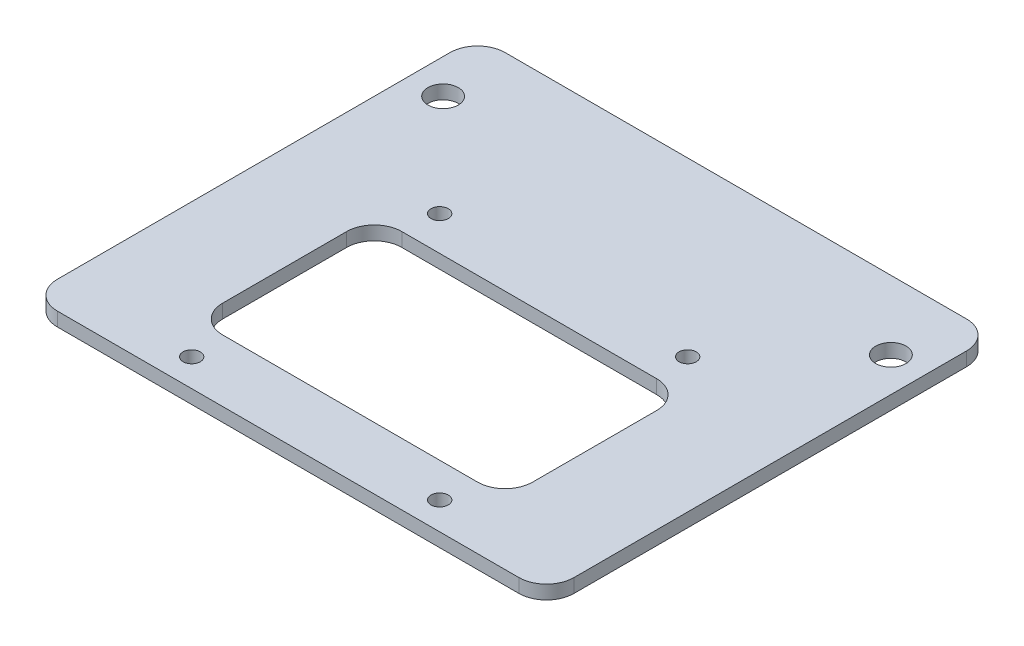
ISO-10303-21;
HEADER;
FILE_DESCRIPTION(('STEP AP214'),'2;1');
FILE_NAME('part.step','',(''),(''),'','','');
FILE_SCHEMA(('AUTOMOTIVE_DESIGN { 1 0 10303 214 1 1 1 1 }'));
ENDSEC;
DATA;
#1=APPLICATION_CONTEXT('core data for automotive mechanical design processes');
#2=APPLICATION_PROTOCOL_DEFINITION('international standard','automotive_design',2000,#1);
#3=PRODUCT_CONTEXT('',#1,'mechanical');
#4=PRODUCT('Part','Part','',(#3));
#5=PRODUCT_RELATED_PRODUCT_CATEGORY('part','',(#4));
#6=PRODUCT_DEFINITION_FORMATION('','',#4);
#7=PRODUCT_DEFINITION_CONTEXT('part definition',#1,'design');
#8=PRODUCT_DEFINITION('design','',#6,#7);
#9=PRODUCT_DEFINITION_SHAPE('','',#8);
#10=(LENGTH_UNIT() NAMED_UNIT(*) SI_UNIT(.MILLI.,.METRE.));
#11=(NAMED_UNIT(*) PLANE_ANGLE_UNIT() SI_UNIT($,.RADIAN.));
#12=(NAMED_UNIT(*) SI_UNIT($,.STERADIAN.) SOLID_ANGLE_UNIT());
#13=UNCERTAINTY_MEASURE_WITH_UNIT(LENGTH_MEASURE(1.E-05),#10,'distance_accuracy_value','');
#14=(GEOMETRIC_REPRESENTATION_CONTEXT(3) GLOBAL_UNCERTAINTY_ASSIGNED_CONTEXT((#13)) GLOBAL_UNIT_ASSIGNED_CONTEXT((#10,
#11,#12)) REPRESENTATION_CONTEXT('',''));
#15=CARTESIAN_POINT('',(0.,0.,0.));
#16=DIRECTION('',(0.,0.,1.));
#17=DIRECTION('',(1.,0.,0.));
#18=AXIS2_PLACEMENT_3D('',#15,#16,#17);
#19=CARTESIAN_POINT('',(37.5,2.,-32.5));
#20=DIRECTION('',(-1.,0.,0.));
#21=DIRECTION('',(0.,0.,1.));
#22=AXIS2_PLACEMENT_3D('',#19,#20,#21);
#23=PLANE('',#22);
#24=DIRECTION('',(0.,0.,-1.));
#25=VECTOR('',#24,1.);
#26=CARTESIAN_POINT('',(37.5,0.,-32.5));
#27=LINE('',#26,#25);
#28=CARTESIAN_POINT('',(37.5,0.,28.5));
#29=VERTEX_POINT('',#28);
#30=CARTESIAN_POINT('',(37.5,0.,-28.5));
#31=VERTEX_POINT('',#30);
#32=EDGE_CURVE('E175',#29,#31,#27,.T.);
#33=ORIENTED_EDGE('',*,*,#32,.T.);
#34=DIRECTION('',(0.,-1.,0.));
#35=VECTOR('',#34,1.);
#36=CARTESIAN_POINT('',(37.5,2.,-28.5));
#37=LINE('',#36,#35);
#38=CARTESIAN_POINT('',(37.5,2.,-28.5));
#39=VERTEX_POINT('',#38);
#40=EDGE_CURVE('E153',#31,#39,#37,.F.);
#41=ORIENTED_EDGE('',*,*,#40,.T.);
#42=DIRECTION('',(0.,0.,-1.));
#43=VECTOR('',#42,1.);
#44=CARTESIAN_POINT('',(37.5,2.,-32.5));
#45=LINE('',#44,#43);
#46=CARTESIAN_POINT('',(37.5,2.,28.5));
#47=VERTEX_POINT('',#46);
#48=EDGE_CURVE('E186',#47,#39,#45,.T.);
#49=ORIENTED_EDGE('',*,*,#48,.F.);
#50=DIRECTION('',(0.,-1.,0.));
#51=VECTOR('',#50,1.);
#52=CARTESIAN_POINT('',(37.5,2.,28.5));
#53=LINE('',#52,#51);
#54=EDGE_CURVE('E158',#47,#29,#53,.T.);
#55=ORIENTED_EDGE('',*,*,#54,.T.);
#56=EDGE_LOOP('',(#33,#41,#49,#55));
#57=FACE_BOUND('',#56,.T.);
#58=ADVANCED_FACE('F35',(#57),#23,.F.);
#59=CARTESIAN_POINT('',(-37.5,2.,-32.5));
#60=DIRECTION('',(0.,0.,1.));
#61=DIRECTION('',(1.,0.,0.));
#62=AXIS2_PLACEMENT_3D('',#59,#60,#61);
#63=PLANE('',#62);
#64=DIRECTION('',(-1.,0.,0.));
#65=VECTOR('',#64,1.);
#66=CARTESIAN_POINT('',(-37.5,2.,-32.5));
#67=LINE('',#66,#65);
#68=CARTESIAN_POINT('',(33.5,2.,-32.5));
#69=VERTEX_POINT('',#68);
#70=CARTESIAN_POINT('',(-33.5,2.,-32.5));
#71=VERTEX_POINT('',#70);
#72=EDGE_CURVE('E168',#69,#71,#67,.T.);
#73=ORIENTED_EDGE('',*,*,#72,.F.);
#74=DIRECTION('',(0.,-1.,0.));
#75=VECTOR('',#74,1.);
#76=CARTESIAN_POINT('',(33.5,2.,-32.5));
#77=LINE('',#76,#75);
#78=CARTESIAN_POINT('',(33.5,0.,-32.5));
#79=VERTEX_POINT('',#78);
#80=EDGE_CURVE('E152',#69,#79,#77,.T.);
#81=ORIENTED_EDGE('',*,*,#80,.T.);
#82=DIRECTION('',(-1.,0.,0.));
#83=VECTOR('',#82,1.);
#84=CARTESIAN_POINT('',(-37.5,0.,-32.5));
#85=LINE('',#84,#83);
#86=CARTESIAN_POINT('',(-33.5,0.,-32.5));
#87=VERTEX_POINT('',#86);
#88=EDGE_CURVE('E165',#79,#87,#85,.T.);
#89=ORIENTED_EDGE('',*,*,#88,.T.);
#90=DIRECTION('',(0.,-1.,0.));
#91=VECTOR('',#90,1.);
#92=CARTESIAN_POINT('',(-33.5,2.,-32.5));
#93=LINE('',#92,#91);
#94=EDGE_CURVE('E170',#87,#71,#93,.F.);
#95=ORIENTED_EDGE('',*,*,#94,.T.);
#96=EDGE_LOOP('',(#73,#81,#89,#95));
#97=FACE_BOUND('',#96,.T.);
#98=ADVANCED_FACE('F164',(#97),#63,.F.);
#99=CARTESIAN_POINT('',(-37.5,2.,-32.5));
#100=DIRECTION('',(1.,0.,0.));
#101=DIRECTION('',(0.,0.,-1.));
#102=AXIS2_PLACEMENT_3D('',#99,#100,#101);
#103=PLANE('',#102);
#104=DIRECTION('',(0.,0.,1.));
#105=VECTOR('',#104,1.);
#106=CARTESIAN_POINT('',(-37.5,0.,-32.5));
#107=LINE('',#106,#105);
#108=CARTESIAN_POINT('',(-37.5,0.,-28.5));
#109=VERTEX_POINT('',#108);
#110=CARTESIAN_POINT('',(-37.5,0.,28.5));
#111=VERTEX_POINT('',#110);
#112=EDGE_CURVE('E174',#109,#111,#107,.T.);
#113=ORIENTED_EDGE('',*,*,#112,.T.);
#114=DIRECTION('',(0.,-1.,0.));
#115=VECTOR('',#114,1.);
#116=CARTESIAN_POINT('',(-37.5,2.,28.5));
#117=LINE('',#116,#115);
#118=CARTESIAN_POINT('',(-37.5,2.,28.5));
#119=VERTEX_POINT('',#118);
#120=EDGE_CURVE('E212',#111,#119,#117,.F.);
#121=ORIENTED_EDGE('',*,*,#120,.T.);
#122=DIRECTION('',(0.,0.,1.));
#123=VECTOR('',#122,1.);
#124=CARTESIAN_POINT('',(-37.5,2.,-32.5));
#125=LINE('',#124,#123);
#126=CARTESIAN_POINT('',(-37.5,2.,-28.5));
#127=VERTEX_POINT('',#126);
#128=EDGE_CURVE('E318',#127,#119,#125,.T.);
#129=ORIENTED_EDGE('',*,*,#128,.F.);
#130=DIRECTION('',(0.,-1.,0.));
#131=VECTOR('',#130,1.);
#132=CARTESIAN_POINT('',(-37.5,2.,-28.5));
#133=LINE('',#132,#131);
#134=EDGE_CURVE('E209',#127,#109,#133,.T.);
#135=ORIENTED_EDGE('',*,*,#134,.T.);
#136=EDGE_LOOP('',(#113,#121,#129,#135));
#137=FACE_BOUND('',#136,.T.);
#138=ADVANCED_FACE('F339',(#137),#103,.F.);
#139=CARTESIAN_POINT('',(-37.5,2.,32.5));
#140=DIRECTION('',(0.,0.,-1.));
#141=DIRECTION('',(-1.,0.,0.));
#142=AXIS2_PLACEMENT_3D('',#139,#140,#141);
#143=PLANE('',#142);
#144=DIRECTION('',(1.,0.,0.));
#145=VECTOR('',#144,1.);
#146=CARTESIAN_POINT('',(-37.5,0.,32.5));
#147=LINE('',#146,#145);
#148=CARTESIAN_POINT('',(-33.5,0.,32.5));
#149=VERTEX_POINT('',#148);
#150=CARTESIAN_POINT('',(33.5,0.,32.5));
#151=VERTEX_POINT('',#150);
#152=EDGE_CURVE('E178',#149,#151,#147,.T.);
#153=ORIENTED_EDGE('',*,*,#152,.T.);
#154=DIRECTION('',(0.,-1.,0.));
#155=VECTOR('',#154,1.);
#156=CARTESIAN_POINT('',(33.5,2.,32.5));
#157=LINE('',#156,#155);
#158=CARTESIAN_POINT('',(33.5,2.,32.5));
#159=VERTEX_POINT('',#158);
#160=EDGE_CURVE('E207',#151,#159,#157,.F.);
#161=ORIENTED_EDGE('',*,*,#160,.T.);
#162=DIRECTION('',(1.,0.,0.));
#163=VECTOR('',#162,1.);
#164=CARTESIAN_POINT('',(-37.5,2.,32.5));
#165=LINE('',#164,#163);
#166=CARTESIAN_POINT('',(-33.5,2.,32.5));
#167=VERTEX_POINT('',#166);
#168=EDGE_CURVE('E187',#167,#159,#165,.T.);
#169=ORIENTED_EDGE('',*,*,#168,.F.);
#170=DIRECTION('',(0.,-1.,0.));
#171=VECTOR('',#170,1.);
#172=CARTESIAN_POINT('',(-33.5,2.,32.5));
#173=LINE('',#172,#171);
#174=EDGE_CURVE('E204',#167,#149,#173,.T.);
#175=ORIENTED_EDGE('',*,*,#174,.T.);
#176=EDGE_LOOP('',(#153,#161,#169,#175));
#177=FACE_BOUND('',#176,.T.);
#178=ADVANCED_FACE('F334',(#177),#143,.F.);
#179=CARTESIAN_POINT('',(0.,2.,0.));
#180=DIRECTION('',(0.,1.,0.));
#181=DIRECTION('',(0.,0.,1.));
#182=AXIS2_PLACEMENT_3D('',#179,#180,#181);
#183=PLANE('',#182);
#184=DIRECTION('',(0.,0.,1.));
#185=VECTOR('',#184,1.);
#186=CARTESIAN_POINT('',(-22.5,2.,-2.5));
#187=LINE('',#186,#185);
#188=CARTESIAN_POINT('',(-22.5,2.,1.5));
#189=VERTEX_POINT('',#188);
#190=CARTESIAN_POINT('',(-22.5,2.,19.5));
#191=VERTEX_POINT('',#190);
#192=EDGE_CURVE('E251',#189,#191,#187,.T.);
#193=ORIENTED_EDGE('',*,*,#192,.F.);
#194=CARTESIAN_POINT('',(-18.5,2.,1.5));
#195=DIRECTION('',(0.,1.,0.));
#196=DIRECTION('',(0.,0.,1.));
#197=AXIS2_PLACEMENT_3D('',#194,#195,#196);
#198=CIRCLE('',#197,4.);
#199=CARTESIAN_POINT('',(-18.5,2.,-2.5));
#200=VERTEX_POINT('',#199);
#201=EDGE_CURVE('E43',#189,#200,#198,.F.);
#202=ORIENTED_EDGE('',*,*,#201,.T.);
#203=DIRECTION('',(-1.,0.,0.));
#204=VECTOR('',#203,1.);
#205=CARTESIAN_POINT('',(-22.5,2.,-2.5));
#206=LINE('',#205,#204);
#207=CARTESIAN_POINT('',(18.5,2.,-2.5));
#208=VERTEX_POINT('',#207);
#209=EDGE_CURVE('E250',#208,#200,#206,.T.);
#210=ORIENTED_EDGE('',*,*,#209,.F.);
#211=CARTESIAN_POINT('',(18.5,2.,1.5));
#212=DIRECTION('',(0.,1.,0.));
#213=DIRECTION('',(0.,0.,1.));
#214=AXIS2_PLACEMENT_3D('',#211,#212,#213);
#215=CIRCLE('',#214,4.);
#216=CARTESIAN_POINT('',(22.5,2.,1.5));
#217=VERTEX_POINT('',#216);
#218=EDGE_CURVE('E233',#208,#217,#215,.F.);
#219=ORIENTED_EDGE('',*,*,#218,.T.);
#220=DIRECTION('',(0.,0.,-1.));
#221=VECTOR('',#220,1.);
#222=CARTESIAN_POINT('',(22.5,2.,-2.5));
#223=LINE('',#222,#221);
#224=CARTESIAN_POINT('',(22.5,2.,19.5));
#225=VERTEX_POINT('',#224);
#226=EDGE_CURVE('E260',#225,#217,#223,.T.);
#227=ORIENTED_EDGE('',*,*,#226,.F.);
#228=CARTESIAN_POINT('',(18.5,2.,19.5));
#229=DIRECTION('',(0.,1.,0.));
#230=DIRECTION('',(0.,0.,1.));
#231=AXIS2_PLACEMENT_3D('',#228,#229,#230);
#232=CIRCLE('',#231,4.);
#233=CARTESIAN_POINT('',(18.5,2.,23.5));
#234=VERTEX_POINT('',#233);
#235=EDGE_CURVE('E237',#225,#234,#232,.F.);
#236=ORIENTED_EDGE('',*,*,#235,.T.);
#237=DIRECTION('',(1.,0.,0.));
#238=VECTOR('',#237,1.);
#239=CARTESIAN_POINT('',(-22.5,2.,23.5));
#240=LINE('',#239,#238);
#241=CARTESIAN_POINT('',(-18.5,2.,23.5));
#242=VERTEX_POINT('',#241);
#243=EDGE_CURVE('E276',#242,#234,#240,.T.);
#244=ORIENTED_EDGE('',*,*,#243,.F.);
#245=CARTESIAN_POINT('',(-18.5,2.,19.5));
#246=DIRECTION('',(0.,1.,0.));
#247=DIRECTION('',(0.,0.,1.));
#248=AXIS2_PLACEMENT_3D('',#245,#246,#247);
#249=CIRCLE('',#248,4.);
#250=EDGE_CURVE('E241',#242,#191,#249,.F.);
#251=ORIENTED_EDGE('',*,*,#250,.T.);
#252=EDGE_LOOP('',(#193,#202,#210,#219,#227,#236,#244,#251));
#253=FACE_BOUND('',#252,.T.);
#254=CARTESIAN_POINT('',(18.,2.,-7.5));
#255=DIRECTION('',(0.,1.,0.));
#256=DIRECTION('',(0.,0.,1.));
#257=AXIS2_PLACEMENT_3D('',#254,#255,#256);
#258=CIRCLE('',#257,1.25);
#259=CARTESIAN_POINT('',(18.,2.,-6.25));
#260=VERTEX_POINT('',#259);
#261=EDGE_CURVE('E274',#260,#260,#258,.T.);
#262=ORIENTED_EDGE('',*,*,#261,.F.);
#263=EDGE_LOOP('',(#262));
#264=FACE_BOUND('',#263,.T.);
#265=CARTESIAN_POINT('',(18.,2.,28.5));
#266=DIRECTION('',(0.,1.,0.));
#267=DIRECTION('',(0.,0.,1.));
#268=AXIS2_PLACEMENT_3D('',#265,#266,#267);
#269=CIRCLE('',#268,1.25);
#270=CARTESIAN_POINT('',(18.,2.,29.75));
#271=VERTEX_POINT('',#270);
#272=EDGE_CURVE('E286',#271,#271,#269,.T.);
#273=ORIENTED_EDGE('',*,*,#272,.F.);
#274=EDGE_LOOP('',(#273));
#275=FACE_BOUND('',#274,.T.);
#276=CARTESIAN_POINT('',(-18.,2.,-7.5));
#277=DIRECTION('',(0.,1.,0.));
#278=DIRECTION('',(0.,0.,1.));
#279=AXIS2_PLACEMENT_3D('',#276,#277,#278);
#280=CIRCLE('',#279,1.25);
#281=CARTESIAN_POINT('',(-18.,2.,-6.25));
#282=VERTEX_POINT('',#281);
#283=EDGE_CURVE('E292',#282,#282,#280,.T.);
#284=ORIENTED_EDGE('',*,*,#283,.F.);
#285=EDGE_LOOP('',(#284));
#286=FACE_BOUND('',#285,.T.);
#287=CARTESIAN_POINT('',(-18.,2.,28.5));
#288=DIRECTION('',(0.,1.,0.));
#289=DIRECTION('',(0.,0.,1.));
#290=AXIS2_PLACEMENT_3D('',#287,#288,#289);
#291=CIRCLE('',#290,1.25);
#292=CARTESIAN_POINT('',(-18.,2.,29.75));
#293=VERTEX_POINT('',#292);
#294=EDGE_CURVE('E298',#293,#293,#291,.T.);
#295=ORIENTED_EDGE('',*,*,#294,.F.);
#296=EDGE_LOOP('',(#295));
#297=FACE_BOUND('',#296,.T.);
#298=CARTESIAN_POINT('',(-32.5,2.,-22.5));
#299=DIRECTION('',(0.,1.,0.));
#300=DIRECTION('',(0.,0.,1.));
#301=AXIS2_PLACEMENT_3D('',#298,#299,#300);
#302=CIRCLE('',#301,2.2);
#303=CARTESIAN_POINT('',(-32.5,2.,-20.3));
#304=VERTEX_POINT('',#303);
#305=EDGE_CURVE('E304',#304,#304,#302,.T.);
#306=ORIENTED_EDGE('',*,*,#305,.F.);
#307=EDGE_LOOP('',(#306));
#308=FACE_BOUND('',#307,.T.);
#309=CARTESIAN_POINT('',(32.5,2.,-22.5));
#310=DIRECTION('',(0.,1.,0.));
#311=DIRECTION('',(0.,0.,1.));
#312=AXIS2_PLACEMENT_3D('',#309,#310,#311);
#313=CIRCLE('',#312,2.2);
#314=CARTESIAN_POINT('',(32.5,2.,-20.3));
#315=VERTEX_POINT('',#314);
#316=EDGE_CURVE('E310',#315,#315,#313,.T.);
#317=ORIENTED_EDGE('',*,*,#316,.F.);
#318=EDGE_LOOP('',(#317));
#319=FACE_BOUND('',#318,.T.);
#320=ORIENTED_EDGE('',*,*,#48,.T.);
#321=CARTESIAN_POINT('',(33.5,2.,-28.5));
#322=DIRECTION('',(0.,1.,0.));
#323=DIRECTION('',(0.,0.,1.));
#324=AXIS2_PLACEMENT_3D('',#321,#322,#323);
#325=CIRCLE('',#324,4.);
#326=EDGE_CURVE('E202',#39,#69,#325,.T.);
#327=ORIENTED_EDGE('',*,*,#326,.T.);
#328=ORIENTED_EDGE('',*,*,#72,.T.);
#329=CARTESIAN_POINT('',(-33.5,2.,-28.5));
#330=DIRECTION('',(0.,1.,0.));
#331=DIRECTION('',(0.,0.,1.));
#332=AXIS2_PLACEMENT_3D('',#329,#330,#331);
#333=CIRCLE('',#332,4.);
#334=EDGE_CURVE('E196',#71,#127,#333,.T.);
#335=ORIENTED_EDGE('',*,*,#334,.T.);
#336=ORIENTED_EDGE('',*,*,#128,.T.);
#337=CARTESIAN_POINT('',(-33.5,2.,28.5));
#338=DIRECTION('',(0.,1.,0.));
#339=DIRECTION('',(0.,0.,1.));
#340=AXIS2_PLACEMENT_3D('',#337,#338,#339);
#341=CIRCLE('',#340,4.);
#342=EDGE_CURVE('E198',#119,#167,#341,.T.);
#343=ORIENTED_EDGE('',*,*,#342,.T.);
#344=ORIENTED_EDGE('',*,*,#168,.T.);
#345=CARTESIAN_POINT('',(33.5,2.,28.5));
#346=DIRECTION('',(0.,1.,0.));
#347=DIRECTION('',(0.,0.,1.));
#348=AXIS2_PLACEMENT_3D('',#345,#346,#347);
#349=CIRCLE('',#348,4.);
#350=EDGE_CURVE('E200',#159,#47,#349,.T.);
#351=ORIENTED_EDGE('',*,*,#350,.T.);
#352=EDGE_LOOP('',(#320,#327,#328,#335,#336,#343,#344,#351));
#353=FACE_BOUND('',#352,.T.);
#354=ADVANCED_FACE('F248',(#253,#264,#275,#286,#297,#308,#319,#353),#183,.T.);
#355=CARTESIAN_POINT('',(0.,0.,0.));
#356=DIRECTION('',(0.,1.,0.));
#357=DIRECTION('',(0.,0.,1.));
#358=AXIS2_PLACEMENT_3D('',#355,#356,#357);
#359=PLANE('',#358);
#360=DIRECTION('',(0.,0.,-1.));
#361=VECTOR('',#360,1.);
#362=CARTESIAN_POINT('',(22.5,0.,-2.5));
#363=LINE('',#362,#361);
#364=CARTESIAN_POINT('',(22.5,0.,19.5));
#365=VERTEX_POINT('',#364);
#366=CARTESIAN_POINT('',(22.5,0.,1.5));
#367=VERTEX_POINT('',#366);
#368=EDGE_CURVE('E267',#365,#367,#363,.T.);
#369=ORIENTED_EDGE('',*,*,#368,.T.);
#370=CARTESIAN_POINT('',(18.5,0.,1.5));
#371=DIRECTION('',(0.,1.,0.));
#372=DIRECTION('',(0.,0.,1.));
#373=AXIS2_PLACEMENT_3D('',#370,#371,#372);
#374=CIRCLE('',#373,4.);
#375=CARTESIAN_POINT('',(18.5,0.,-2.5));
#376=VERTEX_POINT('',#375);
#377=EDGE_CURVE('E235',#367,#376,#374,.T.);
#378=ORIENTED_EDGE('',*,*,#377,.T.);
#379=DIRECTION('',(-1.,0.,0.));
#380=VECTOR('',#379,1.);
#381=CARTESIAN_POINT('',(-22.5,0.,-2.5));
#382=LINE('',#381,#380);
#383=CARTESIAN_POINT('',(-18.5,0.,-2.5));
#384=VERTEX_POINT('',#383);
#385=EDGE_CURVE('E272',#376,#384,#382,.T.);
#386=ORIENTED_EDGE('',*,*,#385,.T.);
#387=CARTESIAN_POINT('',(-18.5,0.,1.5));
#388=DIRECTION('',(0.,1.,0.));
#389=DIRECTION('',(0.,0.,1.));
#390=AXIS2_PLACEMENT_3D('',#387,#388,#389);
#391=CIRCLE('',#390,4.);
#392=CARTESIAN_POINT('',(-22.5,0.,1.5));
#393=VERTEX_POINT('',#392);
#394=EDGE_CURVE('E11',#384,#393,#391,.T.);
#395=ORIENTED_EDGE('',*,*,#394,.T.);
#396=DIRECTION('',(0.,0.,1.));
#397=VECTOR('',#396,1.);
#398=CARTESIAN_POINT('',(-22.5,0.,-2.5));
#399=LINE('',#398,#397);
#400=CARTESIAN_POINT('',(-22.5,0.,19.5));
#401=VERTEX_POINT('',#400);
#402=EDGE_CURVE('E259',#393,#401,#399,.T.);
#403=ORIENTED_EDGE('',*,*,#402,.T.);
#404=CARTESIAN_POINT('',(-18.5,0.,19.5));
#405=DIRECTION('',(0.,1.,0.));
#406=DIRECTION('',(0.,0.,1.));
#407=AXIS2_PLACEMENT_3D('',#404,#405,#406);
#408=CIRCLE('',#407,4.);
#409=CARTESIAN_POINT('',(-18.5,0.,23.5));
#410=VERTEX_POINT('',#409);
#411=EDGE_CURVE('E243',#401,#410,#408,.T.);
#412=ORIENTED_EDGE('',*,*,#411,.T.);
#413=DIRECTION('',(1.,0.,0.));
#414=VECTOR('',#413,1.);
#415=CARTESIAN_POINT('',(-22.5,0.,23.5));
#416=LINE('',#415,#414);
#417=CARTESIAN_POINT('',(18.5,0.,23.5));
#418=VERTEX_POINT('',#417);
#419=EDGE_CURVE('E264',#410,#418,#416,.T.);
#420=ORIENTED_EDGE('',*,*,#419,.T.);
#421=CARTESIAN_POINT('',(18.5,0.,19.5));
#422=DIRECTION('',(0.,1.,0.));
#423=DIRECTION('',(0.,0.,1.));
#424=AXIS2_PLACEMENT_3D('',#421,#422,#423);
#425=CIRCLE('',#424,4.);
#426=EDGE_CURVE('E239',#418,#365,#425,.T.);
#427=ORIENTED_EDGE('',*,*,#426,.T.);
#428=EDGE_LOOP('',(#369,#378,#386,#395,#403,#412,#420,#427));
#429=FACE_BOUND('',#428,.T.);
#430=CARTESIAN_POINT('',(18.,0.,-7.5));
#431=DIRECTION('',(0.,1.,0.));
#432=DIRECTION('',(0.,0.,1.));
#433=AXIS2_PLACEMENT_3D('',#430,#431,#432);
#434=CIRCLE('',#433,1.25);
#435=CARTESIAN_POINT('',(18.,0.,-6.25));
#436=VERTEX_POINT('',#435);
#437=EDGE_CURVE('E283',#436,#436,#434,.T.);
#438=ORIENTED_EDGE('',*,*,#437,.T.);
#439=EDGE_LOOP('',(#438));
#440=FACE_BOUND('',#439,.T.);
#441=CARTESIAN_POINT('',(18.,0.,28.5));
#442=DIRECTION('',(0.,1.,0.));
#443=DIRECTION('',(0.,0.,1.));
#444=AXIS2_PLACEMENT_3D('',#441,#442,#443);
#445=CIRCLE('',#444,1.25);
#446=CARTESIAN_POINT('',(18.,0.,29.75));
#447=VERTEX_POINT('',#446);
#448=EDGE_CURVE('E289',#447,#447,#445,.T.);
#449=ORIENTED_EDGE('',*,*,#448,.T.);
#450=EDGE_LOOP('',(#449));
#451=FACE_BOUND('',#450,.T.);
#452=CARTESIAN_POINT('',(-18.,0.,-7.5));
#453=DIRECTION('',(0.,1.,0.));
#454=DIRECTION('',(0.,0.,1.));
#455=AXIS2_PLACEMENT_3D('',#452,#453,#454);
#456=CIRCLE('',#455,1.25);
#457=CARTESIAN_POINT('',(-18.,0.,-6.25));
#458=VERTEX_POINT('',#457);
#459=EDGE_CURVE('E295',#458,#458,#456,.T.);
#460=ORIENTED_EDGE('',*,*,#459,.T.);
#461=EDGE_LOOP('',(#460));
#462=FACE_BOUND('',#461,.T.);
#463=CARTESIAN_POINT('',(-18.,0.,28.5));
#464=DIRECTION('',(0.,1.,0.));
#465=DIRECTION('',(0.,0.,1.));
#466=AXIS2_PLACEMENT_3D('',#463,#464,#465);
#467=CIRCLE('',#466,1.25);
#468=CARTESIAN_POINT('',(-18.,0.,29.75));
#469=VERTEX_POINT('',#468);
#470=EDGE_CURVE('E301',#469,#469,#467,.T.);
#471=ORIENTED_EDGE('',*,*,#470,.T.);
#472=EDGE_LOOP('',(#471));
#473=FACE_BOUND('',#472,.T.);
#474=CARTESIAN_POINT('',(-32.5,0.,-22.5));
#475=DIRECTION('',(0.,1.,0.));
#476=DIRECTION('',(0.,0.,1.));
#477=AXIS2_PLACEMENT_3D('',#474,#475,#476);
#478=CIRCLE('',#477,2.2);
#479=CARTESIAN_POINT('',(-32.5,0.,-20.3));
#480=VERTEX_POINT('',#479);
#481=EDGE_CURVE('E307',#480,#480,#478,.T.);
#482=ORIENTED_EDGE('',*,*,#481,.T.);
#483=EDGE_LOOP('',(#482));
#484=FACE_BOUND('',#483,.T.);
#485=CARTESIAN_POINT('',(32.5,0.,-22.5));
#486=DIRECTION('',(0.,1.,0.));
#487=DIRECTION('',(0.,0.,1.));
#488=AXIS2_PLACEMENT_3D('',#485,#486,#487);
#489=CIRCLE('',#488,2.2);
#490=CARTESIAN_POINT('',(32.5,0.,-20.3));
#491=VERTEX_POINT('',#490);
#492=EDGE_CURVE('E180',#491,#491,#489,.T.);
#493=ORIENTED_EDGE('',*,*,#492,.T.);
#494=EDGE_LOOP('',(#493));
#495=FACE_BOUND('',#494,.T.);
#496=ORIENTED_EDGE('',*,*,#88,.F.);
#497=CARTESIAN_POINT('',(33.5,0.,-28.5));
#498=DIRECTION('',(0.,1.,0.));
#499=DIRECTION('',(0.,0.,1.));
#500=AXIS2_PLACEMENT_3D('',#497,#498,#499);
#501=CIRCLE('',#500,4.);
#502=EDGE_CURVE('E148',#79,#31,#501,.F.);
#503=ORIENTED_EDGE('',*,*,#502,.T.);
#504=ORIENTED_EDGE('',*,*,#32,.F.);
#505=CARTESIAN_POINT('',(33.5,0.,28.5));
#506=DIRECTION('',(0.,1.,0.));
#507=DIRECTION('',(0.,0.,1.));
#508=AXIS2_PLACEMENT_3D('',#505,#506,#507);
#509=CIRCLE('',#508,4.);
#510=EDGE_CURVE('E159',#29,#151,#509,.F.);
#511=ORIENTED_EDGE('',*,*,#510,.T.);
#512=ORIENTED_EDGE('',*,*,#152,.F.);
#513=CARTESIAN_POINT('',(-33.5,0.,28.5));
#514=DIRECTION('',(0.,1.,0.));
#515=DIRECTION('',(0.,0.,1.));
#516=AXIS2_PLACEMENT_3D('',#513,#514,#515);
#517=CIRCLE('',#516,4.);
#518=EDGE_CURVE('E190',#149,#111,#517,.F.);
#519=ORIENTED_EDGE('',*,*,#518,.T.);
#520=ORIENTED_EDGE('',*,*,#112,.F.);
#521=CARTESIAN_POINT('',(-33.5,0.,-28.5));
#522=DIRECTION('',(0.,1.,0.));
#523=DIRECTION('',(0.,0.,1.));
#524=AXIS2_PLACEMENT_3D('',#521,#522,#523);
#525=CIRCLE('',#524,4.);
#526=EDGE_CURVE('E169',#109,#87,#525,.F.);
#527=ORIENTED_EDGE('',*,*,#526,.T.);
#528=EDGE_LOOP('',(#496,#503,#504,#511,#512,#519,#520,#527));
#529=FACE_BOUND('',#528,.T.);
#530=ADVANCED_FACE('F172',(#429,#440,#451,#462,#473,#484,#495,#529),#359,.F.);
#531=CARTESIAN_POINT('',(32.5,2.,-22.5));
#532=DIRECTION('',(0.,1.,0.));
#533=DIRECTION('',(0.,0.,1.));
#534=AXIS2_PLACEMENT_3D('',#531,#532,#533);
#535=CYLINDRICAL_SURFACE('',#534,2.2);
#536=ORIENTED_EDGE('',*,*,#492,.F.);
#537=EDGE_LOOP('',(#536));
#538=FACE_BOUND('',#537,.T.);
#539=ORIENTED_EDGE('',*,*,#316,.T.);
#540=EDGE_LOOP('',(#539));
#541=FACE_BOUND('',#540,.T.);
#542=ADVANCED_FACE('F399',(#538,#541),#535,.F.);
#543=CARTESIAN_POINT('',(-32.5,2.,-22.5));
#544=DIRECTION('',(0.,1.,0.));
#545=DIRECTION('',(0.,0.,1.));
#546=AXIS2_PLACEMENT_3D('',#543,#544,#545);
#547=CYLINDRICAL_SURFACE('',#546,2.2);
#548=ORIENTED_EDGE('',*,*,#481,.F.);
#549=EDGE_LOOP('',(#548));
#550=FACE_BOUND('',#549,.T.);
#551=ORIENTED_EDGE('',*,*,#305,.T.);
#552=EDGE_LOOP('',(#551));
#553=FACE_BOUND('',#552,.T.);
#554=ADVANCED_FACE('F497',(#550,#553),#547,.F.);
#555=CARTESIAN_POINT('',(-18.,2.,28.5));
#556=DIRECTION('',(0.,1.,0.));
#557=DIRECTION('',(0.,0.,1.));
#558=AXIS2_PLACEMENT_3D('',#555,#556,#557);
#559=CYLINDRICAL_SURFACE('',#558,1.25);
#560=ORIENTED_EDGE('',*,*,#470,.F.);
#561=EDGE_LOOP('',(#560));
#562=FACE_BOUND('',#561,.T.);
#563=ORIENTED_EDGE('',*,*,#294,.T.);
#564=EDGE_LOOP('',(#563));
#565=FACE_BOUND('',#564,.T.);
#566=ADVANCED_FACE('F504',(#562,#565),#559,.F.);
#567=CARTESIAN_POINT('',(-18.,2.,-7.5));
#568=DIRECTION('',(0.,1.,0.));
#569=DIRECTION('',(0.,0.,1.));
#570=AXIS2_PLACEMENT_3D('',#567,#568,#569);
#571=CYLINDRICAL_SURFACE('',#570,1.25);
#572=ORIENTED_EDGE('',*,*,#459,.F.);
#573=EDGE_LOOP('',(#572));
#574=FACE_BOUND('',#573,.T.);
#575=ORIENTED_EDGE('',*,*,#283,.T.);
#576=EDGE_LOOP('',(#575));
#577=FACE_BOUND('',#576,.T.);
#578=ADVANCED_FACE('F541',(#574,#577),#571,.F.);
#579=CARTESIAN_POINT('',(18.,2.,28.5));
#580=DIRECTION('',(0.,1.,0.));
#581=DIRECTION('',(0.,0.,1.));
#582=AXIS2_PLACEMENT_3D('',#579,#580,#581);
#583=CYLINDRICAL_SURFACE('',#582,1.25);
#584=ORIENTED_EDGE('',*,*,#448,.F.);
#585=EDGE_LOOP('',(#584));
#586=FACE_BOUND('',#585,.T.);
#587=ORIENTED_EDGE('',*,*,#272,.T.);
#588=EDGE_LOOP('',(#587));
#589=FACE_BOUND('',#588,.T.);
#590=ADVANCED_FACE('F532',(#586,#589),#583,.F.);
#591=CARTESIAN_POINT('',(18.,2.,-7.5));
#592=DIRECTION('',(0.,1.,0.));
#593=DIRECTION('',(0.,0.,1.));
#594=AXIS2_PLACEMENT_3D('',#591,#592,#593);
#595=CYLINDRICAL_SURFACE('',#594,1.25);
#596=ORIENTED_EDGE('',*,*,#437,.F.);
#597=EDGE_LOOP('',(#596));
#598=FACE_BOUND('',#597,.T.);
#599=ORIENTED_EDGE('',*,*,#261,.T.);
#600=EDGE_LOOP('',(#599));
#601=FACE_BOUND('',#600,.T.);
#602=ADVANCED_FACE('F364',(#598,#601),#595,.F.);
#603=CARTESIAN_POINT('',(33.5,2.,-28.5));
#604=DIRECTION('',(0.,-1.,0.));
#605=DIRECTION('',(0.,0.,-1.));
#606=AXIS2_PLACEMENT_3D('',#603,#604,#605);
#607=CYLINDRICAL_SURFACE('',#606,4.);
#608=ORIENTED_EDGE('',*,*,#326,.F.);
#609=ORIENTED_EDGE('',*,*,#40,.F.);
#610=ORIENTED_EDGE('',*,*,#502,.F.);
#611=ORIENTED_EDGE('',*,*,#80,.F.);
#612=EDGE_LOOP('',(#608,#609,#610,#611));
#613=FACE_BOUND('',#612,.T.);
#614=ADVANCED_FACE('F151',(#613),#607,.T.);
#615=CARTESIAN_POINT('',(33.5,2.,28.5));
#616=DIRECTION('',(0.,-1.,0.));
#617=DIRECTION('',(0.,0.,-1.));
#618=AXIS2_PLACEMENT_3D('',#615,#616,#617);
#619=CYLINDRICAL_SURFACE('',#618,4.);
#620=ORIENTED_EDGE('',*,*,#350,.F.);
#621=ORIENTED_EDGE('',*,*,#160,.F.);
#622=ORIENTED_EDGE('',*,*,#510,.F.);
#623=ORIENTED_EDGE('',*,*,#54,.F.);
#624=EDGE_LOOP('',(#620,#621,#622,#623));
#625=FACE_BOUND('',#624,.T.);
#626=ADVANCED_FACE('F331',(#625),#619,.T.);
#627=CARTESIAN_POINT('',(-33.5,2.,28.5));
#628=DIRECTION('',(0.,-1.,0.));
#629=DIRECTION('',(0.,0.,-1.));
#630=AXIS2_PLACEMENT_3D('',#627,#628,#629);
#631=CYLINDRICAL_SURFACE('',#630,4.);
#632=ORIENTED_EDGE('',*,*,#342,.F.);
#633=ORIENTED_EDGE('',*,*,#120,.F.);
#634=ORIENTED_EDGE('',*,*,#518,.F.);
#635=ORIENTED_EDGE('',*,*,#174,.F.);
#636=EDGE_LOOP('',(#632,#633,#634,#635));
#637=FACE_BOUND('',#636,.T.);
#638=ADVANCED_FACE('F336',(#637),#631,.T.);
#639=CARTESIAN_POINT('',(-33.5,2.,-28.5));
#640=DIRECTION('',(0.,-1.,0.));
#641=DIRECTION('',(0.,0.,-1.));
#642=AXIS2_PLACEMENT_3D('',#639,#640,#641);
#643=CYLINDRICAL_SURFACE('',#642,4.);
#644=ORIENTED_EDGE('',*,*,#334,.F.);
#645=ORIENTED_EDGE('',*,*,#94,.F.);
#646=ORIENTED_EDGE('',*,*,#526,.F.);
#647=ORIENTED_EDGE('',*,*,#134,.F.);
#648=EDGE_LOOP('',(#644,#645,#646,#647));
#649=FACE_BOUND('',#648,.T.);
#650=ADVANCED_FACE('F344',(#649),#643,.T.);
#651=CARTESIAN_POINT('',(-22.5,0.,-2.5));
#652=DIRECTION('',(-1.,0.,0.));
#653=DIRECTION('',(0.,0.,1.));
#654=AXIS2_PLACEMENT_3D('',#651,#652,#653);
#655=PLANE('',#654);
#656=ORIENTED_EDGE('',*,*,#192,.T.);
#657=DIRECTION('',(0.,1.,0.));
#658=VECTOR('',#657,1.);
#659=CARTESIAN_POINT('',(-22.5,0.,19.5));
#660=LINE('',#659,#658);
#661=EDGE_CURVE('E50',#191,#401,#660,.F.);
#662=ORIENTED_EDGE('',*,*,#661,.T.);
#663=ORIENTED_EDGE('',*,*,#402,.F.);
#664=DIRECTION('',(0.,1.,0.));
#665=VECTOR('',#664,1.);
#666=CARTESIAN_POINT('',(-22.5,2.,1.5));
#667=LINE('',#666,#665);
#668=EDGE_CURVE('E229',#393,#189,#667,.T.);
#669=ORIENTED_EDGE('',*,*,#668,.T.);
#670=EDGE_LOOP('',(#656,#662,#663,#669));
#671=FACE_BOUND('',#670,.T.);
#672=ADVANCED_FACE('F262',(#671),#655,.F.);
#673=CARTESIAN_POINT('',(-22.5,0.,-2.5));
#674=DIRECTION('',(0.,0.,-1.));
#675=DIRECTION('',(-1.,0.,0.));
#676=AXIS2_PLACEMENT_3D('',#673,#674,#675);
#677=PLANE('',#676);
#678=ORIENTED_EDGE('',*,*,#385,.F.);
#679=DIRECTION('',(0.,1.,0.));
#680=VECTOR('',#679,1.);
#681=CARTESIAN_POINT('',(18.5,2.,-2.5));
#682=LINE('',#681,#680);
#683=EDGE_CURVE('E216',#376,#208,#682,.T.);
#684=ORIENTED_EDGE('',*,*,#683,.T.);
#685=ORIENTED_EDGE('',*,*,#209,.T.);
#686=DIRECTION('',(0.,1.,0.));
#687=VECTOR('',#686,1.);
#688=CARTESIAN_POINT('',(-18.5,0.,-2.5));
#689=LINE('',#688,#687);
#690=EDGE_CURVE('E214',#200,#384,#689,.F.);
#691=ORIENTED_EDGE('',*,*,#690,.T.);
#692=EDGE_LOOP('',(#678,#684,#685,#691));
#693=FACE_BOUND('',#692,.T.);
#694=ADVANCED_FACE('F257',(#693),#677,.F.);
#695=CARTESIAN_POINT('',(22.5,0.,-2.5));
#696=DIRECTION('',(1.,0.,0.));
#697=DIRECTION('',(0.,0.,-1.));
#698=AXIS2_PLACEMENT_3D('',#695,#696,#697);
#699=PLANE('',#698);
#700=ORIENTED_EDGE('',*,*,#226,.T.);
#701=DIRECTION('',(0.,1.,0.));
#702=VECTOR('',#701,1.);
#703=CARTESIAN_POINT('',(22.5,0.,1.5));
#704=LINE('',#703,#702);
#705=EDGE_CURVE('E222',#217,#367,#704,.F.);
#706=ORIENTED_EDGE('',*,*,#705,.T.);
#707=ORIENTED_EDGE('',*,*,#368,.F.);
#708=DIRECTION('',(0.,1.,0.));
#709=VECTOR('',#708,1.);
#710=CARTESIAN_POINT('',(22.5,2.,19.5));
#711=LINE('',#710,#709);
#712=EDGE_CURVE('E219',#365,#225,#711,.T.);
#713=ORIENTED_EDGE('',*,*,#712,.T.);
#714=EDGE_LOOP('',(#700,#706,#707,#713));
#715=FACE_BOUND('',#714,.T.);
#716=ADVANCED_FACE('F415',(#715),#699,.F.);
#717=CARTESIAN_POINT('',(-22.5,0.,23.5));
#718=DIRECTION('',(0.,0.,1.));
#719=DIRECTION('',(1.,0.,0.));
#720=AXIS2_PLACEMENT_3D('',#717,#718,#719);
#721=PLANE('',#720);
#722=ORIENTED_EDGE('',*,*,#243,.T.);
#723=DIRECTION('',(0.,1.,0.));
#724=VECTOR('',#723,1.);
#725=CARTESIAN_POINT('',(18.5,0.,23.5));
#726=LINE('',#725,#724);
#727=EDGE_CURVE('E227',#234,#418,#726,.F.);
#728=ORIENTED_EDGE('',*,*,#727,.T.);
#729=ORIENTED_EDGE('',*,*,#419,.F.);
#730=DIRECTION('',(0.,1.,0.));
#731=VECTOR('',#730,1.);
#732=CARTESIAN_POINT('',(-18.5,2.,23.5));
#733=LINE('',#732,#731);
#734=EDGE_CURVE('E224',#410,#242,#733,.T.);
#735=ORIENTED_EDGE('',*,*,#734,.T.);
#736=EDGE_LOOP('',(#722,#728,#729,#735));
#737=FACE_BOUND('',#736,.T.);
#738=ADVANCED_FACE('F424',(#737),#721,.F.);
#739=CARTESIAN_POINT('',(18.5,0.,1.5));
#740=DIRECTION('',(0.,-1.,0.));
#741=DIRECTION('',(0.,0.,-1.));
#742=AXIS2_PLACEMENT_3D('',#739,#740,#741);
#743=CYLINDRICAL_SURFACE('',#742,4.);
#744=ORIENTED_EDGE('',*,*,#377,.F.);
#745=ORIENTED_EDGE('',*,*,#705,.F.);
#746=ORIENTED_EDGE('',*,*,#218,.F.);
#747=ORIENTED_EDGE('',*,*,#683,.F.);
#748=EDGE_LOOP('',(#744,#745,#746,#747));
#749=FACE_BOUND('',#748,.T.);
#750=ADVANCED_FACE('F434',(#749),#743,.F.);
#751=CARTESIAN_POINT('',(18.5,0.,19.5));
#752=DIRECTION('',(0.,-1.,0.));
#753=DIRECTION('',(0.,0.,-1.));
#754=AXIS2_PLACEMENT_3D('',#751,#752,#753);
#755=CYLINDRICAL_SURFACE('',#754,4.);
#756=ORIENTED_EDGE('',*,*,#426,.F.);
#757=ORIENTED_EDGE('',*,*,#727,.F.);
#758=ORIENTED_EDGE('',*,*,#235,.F.);
#759=ORIENTED_EDGE('',*,*,#712,.F.);
#760=EDGE_LOOP('',(#756,#757,#758,#759));
#761=FACE_BOUND('',#760,.T.);
#762=ADVANCED_FACE('F444',(#761),#755,.F.);
#763=CARTESIAN_POINT('',(-18.5,0.,19.5));
#764=DIRECTION('',(0.,-1.,0.));
#765=DIRECTION('',(0.,0.,-1.));
#766=AXIS2_PLACEMENT_3D('',#763,#764,#765);
#767=CYLINDRICAL_SURFACE('',#766,4.);
#768=ORIENTED_EDGE('',*,*,#411,.F.);
#769=ORIENTED_EDGE('',*,*,#661,.F.);
#770=ORIENTED_EDGE('',*,*,#250,.F.);
#771=ORIENTED_EDGE('',*,*,#734,.F.);
#772=EDGE_LOOP('',(#768,#769,#770,#771));
#773=FACE_BOUND('',#772,.T.);
#774=ADVANCED_FACE('F453',(#773),#767,.F.);
#775=CARTESIAN_POINT('',(-18.5,0.,1.5));
#776=DIRECTION('',(0.,-1.,0.));
#777=DIRECTION('',(0.,0.,-1.));
#778=AXIS2_PLACEMENT_3D('',#775,#776,#777);
#779=CYLINDRICAL_SURFACE('',#778,4.);
#780=ORIENTED_EDGE('',*,*,#394,.F.);
#781=ORIENTED_EDGE('',*,*,#690,.F.);
#782=ORIENTED_EDGE('',*,*,#201,.F.);
#783=ORIENTED_EDGE('',*,*,#668,.F.);
#784=EDGE_LOOP('',(#780,#781,#782,#783));
#785=FACE_BOUND('',#784,.T.);
#786=ADVANCED_FACE('F37',(#785),#779,.F.);
#787=CLOSED_SHELL('',(#58,#98,#138,#178,#354,#530,#542,#554,#566,#578,#590,#602,#614,#626,#638,
#650,#672,#694,#716,#738,#750,#762,#774,#786));
#788=MANIFOLD_SOLID_BREP('B2',#787);
#789=ADVANCED_BREP_SHAPE_REPRESENTATION('',(#18,#788),#14);
#790=SHAPE_DEFINITION_REPRESENTATION(#9,#789);
ENDSEC;
END-ISO-10303-21;
